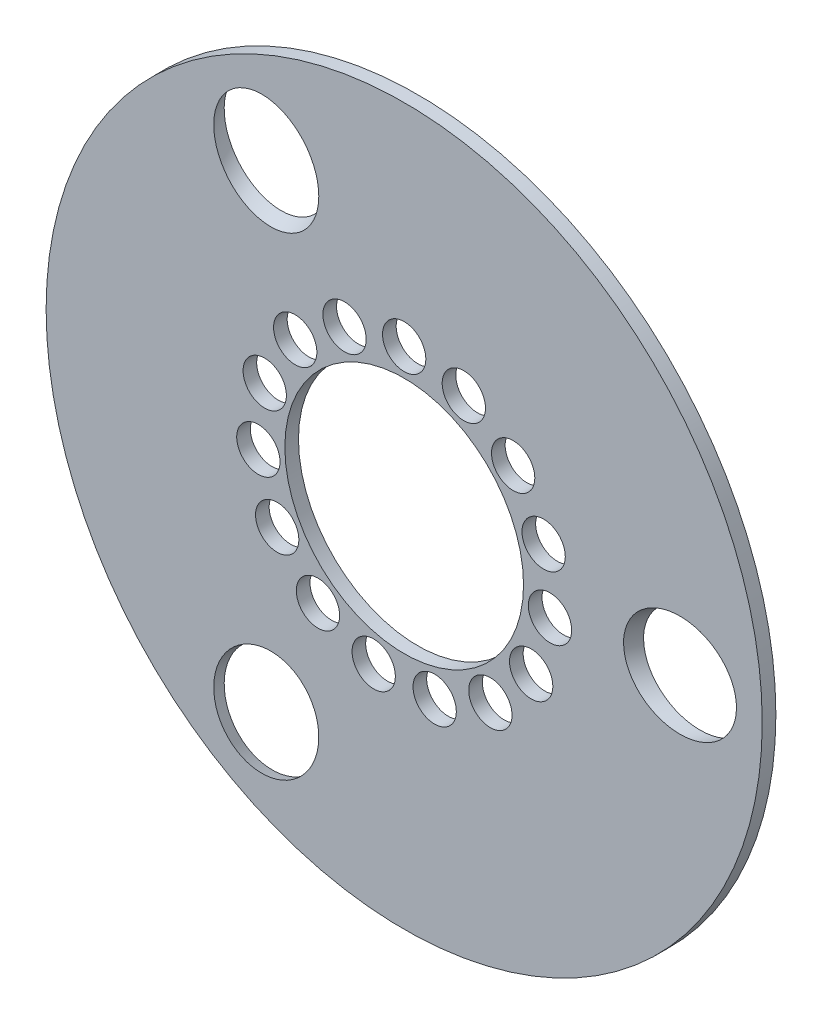
ISO-10303-21;
HEADER;
FILE_DESCRIPTION(('STEP AP214'),'2;1');
FILE_NAME('part.step','',(''),(''),'','','');
FILE_SCHEMA(('AUTOMOTIVE_DESIGN { 1 0 10303 214 1 1 1 1 }'));
ENDSEC;
DATA;
#1=APPLICATION_CONTEXT('core data for automotive mechanical design processes');
#2=APPLICATION_PROTOCOL_DEFINITION('international standard','automotive_design',2000,#1);
#3=PRODUCT_CONTEXT('',#1,'mechanical');
#4=PRODUCT('Part','Part','',(#3));
#5=PRODUCT_RELATED_PRODUCT_CATEGORY('part','',(#4));
#6=PRODUCT_DEFINITION_FORMATION('','',#4);
#7=PRODUCT_DEFINITION_CONTEXT('part definition',#1,'design');
#8=PRODUCT_DEFINITION('design','',#6,#7);
#9=PRODUCT_DEFINITION_SHAPE('','',#8);
#10=(LENGTH_UNIT() NAMED_UNIT(*) SI_UNIT(.MILLI.,.METRE.));
#11=(NAMED_UNIT(*) PLANE_ANGLE_UNIT() SI_UNIT($,.RADIAN.));
#12=(NAMED_UNIT(*) SI_UNIT($,.STERADIAN.) SOLID_ANGLE_UNIT());
#13=UNCERTAINTY_MEASURE_WITH_UNIT(LENGTH_MEASURE(1.E-05),#10,'distance_accuracy_value','');
#14=(GEOMETRIC_REPRESENTATION_CONTEXT(3) GLOBAL_UNCERTAINTY_ASSIGNED_CONTEXT((#13)) GLOBAL_UNIT_ASSIGNED_CONTEXT((#10,
#11,#12)) REPRESENTATION_CONTEXT('',''));
#15=CARTESIAN_POINT('',(0.,0.,0.));
#16=DIRECTION('',(0.,0.,1.));
#17=DIRECTION('',(1.,0.,0.));
#18=AXIS2_PLACEMENT_3D('',#15,#16,#17);
#19=CARTESIAN_POINT('',(0.,0.,2.));
#20=DIRECTION('',(0.,0.,-1.));
#21=DIRECTION('',(-1.,0.,0.));
#22=AXIS2_PLACEMENT_3D('',#19,#20,#21);
#23=CYLINDRICAL_SURFACE('',#22,52.5);
#24=CARTESIAN_POINT('',(0.,0.,2.));
#25=DIRECTION('',(0.,0.,1.));
#26=DIRECTION('',(1.,0.,0.));
#27=AXIS2_PLACEMENT_3D('',#24,#25,#26);
#28=CIRCLE('',#27,52.5);
#29=CARTESIAN_POINT('',(52.5,0.,2.));
#30=VERTEX_POINT('',#29);
#31=EDGE_CURVE('E10',#30,#30,#28,.T.);
#32=ORIENTED_EDGE('',*,*,#31,.F.);
#33=EDGE_LOOP('',(#32));
#34=FACE_BOUND('',#33,.T.);
#35=CARTESIAN_POINT('',(0.,0.,0.));
#36=DIRECTION('',(0.,0.,1.));
#37=DIRECTION('',(1.,0.,0.));
#38=AXIS2_PLACEMENT_3D('',#35,#36,#37);
#39=CIRCLE('',#38,52.5);
#40=CARTESIAN_POINT('',(52.5,0.,0.));
#41=VERTEX_POINT('',#40);
#42=EDGE_CURVE('E40',#41,#41,#39,.T.);
#43=ORIENTED_EDGE('',*,*,#42,.T.);
#44=EDGE_LOOP('',(#43));
#45=FACE_BOUND('',#44,.T.);
#46=ADVANCED_FACE('F33',(#34,#45),#23,.T.);
#47=CARTESIAN_POINT('',(0.,0.,2.));
#48=DIRECTION('',(0.,0.,1.));
#49=DIRECTION('',(1.,0.,0.));
#50=AXIS2_PLACEMENT_3D('',#47,#48,#49);
#51=PLANE('',#50);
#52=CARTESIAN_POINT('',(0.,0.,2.));
#53=DIRECTION('',(0.,0.,1.));
#54=DIRECTION('',(1.,0.,0.));
#55=AXIS2_PLACEMENT_3D('',#52,#53,#54);
#56=CIRCLE('',#55,17.5);
#57=CARTESIAN_POINT('',(17.5,0.,2.));
#58=VERTEX_POINT('',#57);
#59=EDGE_CURVE('E67',#58,#58,#56,.F.);
#60=ORIENTED_EDGE('',*,*,#59,.T.);
#61=EDGE_LOOP('',(#60));
#62=FACE_BOUND('',#61,.T.);
#63=CARTESIAN_POINT('',(-20.2220283223916,35.0255804864794,2.));
#64=DIRECTION('',(0.,0.,1.));
#65=DIRECTION('',(0.499999999999998,-0.86602540378444,0.));
#66=AXIS2_PLACEMENT_3D('',#63,#64,#65);
#67=ELLIPSE('',#66,8.27533439221869,7.5);
#68=CARTESIAN_POINT('',(-16.0843611262823,27.8589306780069,2.));
#69=VERTEX_POINT('',#68);
#70=EDGE_CURVE('E57',#69,#69,#67,.T.);
#71=ORIENTED_EDGE('',*,*,#70,.F.);
#72=EDGE_LOOP('',(#71));
#73=FACE_BOUND('',#72,.T.);
#74=CARTESIAN_POINT('',(-20.2220283223916,-35.0255804864793,2.));
#75=DIRECTION('',(0.,0.,1.));
#76=DIRECTION('',(0.499999999999998,0.86602540378444,0.));
#77=AXIS2_PLACEMENT_3D('',#74,#75,#76);
#78=ELLIPSE('',#77,8.27533439221866,7.5);
#79=CARTESIAN_POINT('',(-16.0843611262822,-27.8589306780068,2.));
#80=VERTEX_POINT('',#79);
#81=EDGE_CURVE('E54',#80,#80,#78,.F.);
#82=ORIENTED_EDGE('',*,*,#81,.T.);
#83=EDGE_LOOP('',(#82));
#84=FACE_BOUND('',#83,.T.);
#85=CARTESIAN_POINT('',(40.4440566447835,0.,2.));
#86=DIRECTION('',(0.,0.,1.));
#87=DIRECTION('',(-1.,0.,0.));
#88=AXIS2_PLACEMENT_3D('',#85,#86,#87);
#89=ELLIPSE('',#88,8.27533439221869,7.5);
#90=CARTESIAN_POINT('',(32.1687222525648,0.,2.));
#91=VERTEX_POINT('',#90);
#92=EDGE_CURVE('E53',#91,#91,#89,.T.);
#93=ORIENTED_EDGE('',*,*,#92,.F.);
#94=EDGE_LOOP('',(#93));
#95=FACE_BOUND('',#94,.T.);
#96=CARTESIAN_POINT('',(8.74483782612977,19.6412273393163,2.));
#97=DIRECTION('',(0.,0.,1.));
#98=DIRECTION('',(1.,0.,0.));
#99=AXIS2_PLACEMENT_3D('',#96,#97,#98);
#100=CIRCLE('',#99,3.175);
#101=CARTESIAN_POINT('',(11.9198378261298,19.6412273393163,2.));
#102=VERTEX_POINT('',#101);
#103=EDGE_CURVE('E110',#102,#102,#100,.T.);
#104=ORIENTED_EDGE('',*,*,#103,.F.);
#105=EDGE_LOOP('',(#104));
#106=FACE_BOUND('',#105,.T.);
#107=CARTESIAN_POINT('',(15.9776137477643,14.3863080367161,2.));
#108=DIRECTION('',(0.,0.,1.));
#109=DIRECTION('',(1.,0.,0.));
#110=AXIS2_PLACEMENT_3D('',#107,#108,#109);
#111=CIRCLE('',#110,3.175);
#112=CARTESIAN_POINT('',(19.1526137477643,14.3863080367161,2.));
#113=VERTEX_POINT('',#112);
#114=EDGE_CURVE('E116',#113,#113,#111,.T.);
#115=ORIENTED_EDGE('',*,*,#114,.F.);
#116=EDGE_LOOP('',(#115));
#117=FACE_BOUND('',#116,.T.);
#118=CARTESIAN_POINT('',(20.4477151003464,6.64386537906218,2.));
#119=DIRECTION('',(0.,0.,1.));
#120=DIRECTION('',(1.,0.,0.));
#121=AXIS2_PLACEMENT_3D('',#118,#119,#120);
#122=CIRCLE('',#121,3.175);
#123=CARTESIAN_POINT('',(23.6227151003464,6.64386537906218,2.));
#124=VERTEX_POINT('',#123);
#125=EDGE_CURVE('E122',#124,#124,#122,.T.);
#126=ORIENTED_EDGE('',*,*,#125,.F.);
#127=EDGE_LOOP('',(#126));
#128=FACE_BOUND('',#127,.T.);
#129=CARTESIAN_POINT('',(21.3822207504188,-2.2473619602537,2.));
#130=DIRECTION('',(0.,0.,1.));
#131=DIRECTION('',(1.,0.,0.));
#132=AXIS2_PLACEMENT_3D('',#129,#130,#131);
#133=CIRCLE('',#132,3.175);
#134=CARTESIAN_POINT('',(24.5572207504188,-2.2473619602537,2.));
#135=VERTEX_POINT('',#134);
#136=EDGE_CURVE('E128',#135,#135,#133,.T.);
#137=ORIENTED_EDGE('',*,*,#136,.F.);
#138=EDGE_LOOP('',(#137));
#139=FACE_BOUND('',#138,.T.);
#140=CARTESIAN_POINT('',(18.6195461813667,-10.7499999999993,2.));
#141=DIRECTION('',(0.,0.,1.));
#142=DIRECTION('',(1.,0.,0.));
#143=AXIS2_PLACEMENT_3D('',#140,#141,#142);
#144=CIRCLE('',#143,3.175);
#145=CARTESIAN_POINT('',(21.7945461813667,-10.7499999999993,2.));
#146=VERTEX_POINT('',#145);
#147=EDGE_CURVE('E134',#146,#146,#144,.T.);
#148=ORIENTED_EDGE('',*,*,#147,.F.);
#149=EDGE_LOOP('',(#148));
#150=FACE_BOUND('',#149,.T.);
#151=CARTESIAN_POINT('',(12.6373829242897,-17.3938653790609,2.));
#152=DIRECTION('',(0.,0.,1.));
#153=DIRECTION('',(1.,0.,0.));
#154=AXIS2_PLACEMENT_3D('',#151,#152,#153);
#155=CIRCLE('',#154,3.175);
#156=CARTESIAN_POINT('',(15.8123829242897,-17.3938653790609,2.));
#157=VERTEX_POINT('',#156);
#158=EDGE_CURVE('E140',#157,#157,#155,.T.);
#159=ORIENTED_EDGE('',*,*,#158,.F.);
#160=EDGE_LOOP('',(#159));
#161=FACE_BOUND('',#160,.T.);
#162=CARTESIAN_POINT('',(4.47010135258351,-21.0301734157766,2.));
#163=DIRECTION('',(0.,0.,1.));
#164=DIRECTION('',(1.,0.,0.));
#165=AXIS2_PLACEMENT_3D('',#162,#163,#164);
#166=CIRCLE('',#165,3.175);
#167=CARTESIAN_POINT('',(7.64510135258351,-21.0301734157766,2.));
#168=VERTEX_POINT('',#167);
#169=EDGE_CURVE('E146',#168,#168,#166,.T.);
#170=ORIENTED_EDGE('',*,*,#169,.F.);
#171=EDGE_LOOP('',(#170));
#172=FACE_BOUND('',#171,.T.);
#173=CARTESIAN_POINT('',(-4.47010135258014,-21.030173415777,2.));
#174=DIRECTION('',(0.,0.,1.));
#175=DIRECTION('',(1.,0.,0.));
#176=AXIS2_PLACEMENT_3D('',#173,#174,#175);
#177=CIRCLE('',#176,3.175);
#178=CARTESIAN_POINT('',(-1.29510135258014,-21.030173415777,2.));
#179=VERTEX_POINT('',#178);
#180=EDGE_CURVE('E152',#179,#179,#177,.T.);
#181=ORIENTED_EDGE('',*,*,#180,.F.);
#182=EDGE_LOOP('',(#181));
#183=FACE_BOUND('',#182,.T.);
#184=CARTESIAN_POINT('',(-12.6373829242866,-17.3938653790619,2.));
#185=DIRECTION('',(0.,0.,1.));
#186=DIRECTION('',(1.,0.,0.));
#187=AXIS2_PLACEMENT_3D('',#184,#185,#186);
#188=CIRCLE('',#187,3.175);
#189=CARTESIAN_POINT('',(-9.46238292428663,-17.3938653790619,2.));
#190=VERTEX_POINT('',#189);
#191=EDGE_CURVE('E74',#190,#190,#188,.T.);
#192=ORIENTED_EDGE('',*,*,#191,.F.);
#193=EDGE_LOOP('',(#192));
#194=FACE_BOUND('',#193,.T.);
#195=CARTESIAN_POINT('',(-18.6195461813642,-10.7500000000007,2.));
#196=DIRECTION('',(0.,0.,1.));
#197=DIRECTION('',(1.,0.,0.));
#198=AXIS2_PLACEMENT_3D('',#195,#196,#197);
#199=CIRCLE('',#198,3.175);
#200=CARTESIAN_POINT('',(-15.4445461813642,-10.7500000000007,2.));
#201=VERTEX_POINT('',#200);
#202=EDGE_CURVE('E81',#201,#201,#199,.T.);
#203=ORIENTED_EDGE('',*,*,#202,.F.);
#204=EDGE_LOOP('',(#203));
#205=FACE_BOUND('',#204,.T.);
#206=CARTESIAN_POINT('',(-21.3822207504169,-2.24736196025541,2.));
#207=DIRECTION('',(0.,0.,1.));
#208=DIRECTION('',(1.,0.,0.));
#209=AXIS2_PLACEMENT_3D('',#206,#207,#208);
#210=CIRCLE('',#209,3.175);
#211=CARTESIAN_POINT('',(-18.2072207504169,-2.24736196025541,2.));
#212=VERTEX_POINT('',#211);
#213=EDGE_CURVE('E87',#212,#212,#210,.T.);
#214=ORIENTED_EDGE('',*,*,#213,.F.);
#215=EDGE_LOOP('',(#214));
#216=FACE_BOUND('',#215,.T.);
#217=CARTESIAN_POINT('',(-20.4477151003452,6.64386537906056,2.));
#218=DIRECTION('',(0.,0.,1.));
#219=DIRECTION('',(1.,0.,0.));
#220=AXIS2_PLACEMENT_3D('',#217,#218,#219);
#221=CIRCLE('',#220,3.175);
#222=CARTESIAN_POINT('',(-17.2727151003452,6.64386537906056,2.));
#223=VERTEX_POINT('',#222);
#224=EDGE_CURVE('E93',#223,#223,#221,.T.);
#225=ORIENTED_EDGE('',*,*,#224,.F.);
#226=EDGE_LOOP('',(#225));
#227=FACE_BOUND('',#226,.T.);
#228=CARTESIAN_POINT('',(-15.9776137477637,14.3863080367148,2.));
#229=DIRECTION('',(0.,0.,1.));
#230=DIRECTION('',(1.,0.,0.));
#231=AXIS2_PLACEMENT_3D('',#228,#229,#230);
#232=CIRCLE('',#231,3.175);
#233=CARTESIAN_POINT('',(-12.8026137477637,14.3863080367148,2.));
#234=VERTEX_POINT('',#233);
#235=EDGE_CURVE('E99',#234,#234,#232,.T.);
#236=ORIENTED_EDGE('',*,*,#235,.F.);
#237=EDGE_LOOP('',(#236));
#238=FACE_BOUND('',#237,.T.);
#239=CARTESIAN_POINT('',(-8.74483782612965,19.6412273393156,2.));
#240=DIRECTION('',(0.,0.,1.));
#241=DIRECTION('',(1.,0.,0.));
#242=AXIS2_PLACEMENT_3D('',#239,#240,#241);
#243=CIRCLE('',#242,3.175);
#244=CARTESIAN_POINT('',(-5.56983782612965,19.6412273393156,2.));
#245=VERTEX_POINT('',#244);
#246=EDGE_CURVE('E105',#245,#245,#243,.T.);
#247=ORIENTED_EDGE('',*,*,#246,.F.);
#248=EDGE_LOOP('',(#247));
#249=FACE_BOUND('',#248,.T.);
#250=CARTESIAN_POINT('',(0.,21.5,2.));
#251=DIRECTION('',(0.,0.,1.));
#252=DIRECTION('',(1.,0.,0.));
#253=AXIS2_PLACEMENT_3D('',#250,#251,#252);
#254=CIRCLE('',#253,3.175);
#255=CARTESIAN_POINT('',(3.175,21.5,2.));
#256=VERTEX_POINT('',#255);
#257=EDGE_CURVE('E45',#256,#256,#254,.T.);
#258=ORIENTED_EDGE('',*,*,#257,.F.);
#259=EDGE_LOOP('',(#258));
#260=FACE_BOUND('',#259,.T.);
#261=ORIENTED_EDGE('',*,*,#31,.T.);
#262=EDGE_LOOP('',(#261));
#263=FACE_BOUND('',#262,.T.);
#264=ADVANCED_FACE('F176',(#62,#73,#84,#95,#106,#117,#128,#139,#150,#161,#172,#183,#194,#205,
#216,#227,#238,#249,#260,#263),#51,.T.);
#265=CARTESIAN_POINT('',(0.,0.,0.));
#266=DIRECTION('',(0.,0.,1.));
#267=DIRECTION('',(1.,0.,0.));
#268=AXIS2_PLACEMENT_3D('',#265,#266,#267);
#269=PLANE('',#268);
#270=CARTESIAN_POINT('',(0.,0.,0.));
#271=DIRECTION('',(0.,0.,1.));
#272=DIRECTION('',(1.,0.,0.));
#273=AXIS2_PLACEMENT_3D('',#270,#271,#272);
#274=CIRCLE('',#273,17.5);
#275=CARTESIAN_POINT('',(17.5,0.,0.));
#276=VERTEX_POINT('',#275);
#277=EDGE_CURVE('E321',#276,#276,#274,.T.);
#278=ORIENTED_EDGE('',*,*,#277,.T.);
#279=EDGE_LOOP('',(#278));
#280=FACE_BOUND('',#279,.T.);
#281=CARTESIAN_POINT('',(-20.6883359805466,35.8332490423623,0.));
#282=DIRECTION('',(0.,0.,1.));
#283=DIRECTION('',(0.499999999999998,-0.86602540378444,0.));
#284=AXIS2_PLACEMENT_3D('',#281,#282,#283);
#285=ELLIPSE('',#284,8.27533439221869,7.5);
#286=CARTESIAN_POINT('',(-16.5506687844373,28.6665992338898,0.));
#287=VERTEX_POINT('',#286);
#288=EDGE_CURVE('E36',#287,#287,#285,.T.);
#289=ORIENTED_EDGE('',*,*,#288,.T.);
#290=EDGE_LOOP('',(#289));
#291=FACE_BOUND('',#290,.T.);
#292=CARTESIAN_POINT('',(-20.6883359805465,-35.8332490423622,0.));
#293=DIRECTION('',(0.,0.,1.));
#294=DIRECTION('',(0.499999999999998,0.86602540378444,0.));
#295=AXIS2_PLACEMENT_3D('',#292,#293,#294);
#296=ELLIPSE('',#295,8.27533439221866,7.5);
#297=CARTESIAN_POINT('',(-16.5506687844372,-28.6665992338897,0.));
#298=VERTEX_POINT('',#297);
#299=EDGE_CURVE('E55',#298,#298,#296,.F.);
#300=ORIENTED_EDGE('',*,*,#299,.F.);
#301=EDGE_LOOP('',(#300));
#302=FACE_BOUND('',#301,.T.);
#303=CARTESIAN_POINT('',(41.3766719610935,0.,0.));
#304=DIRECTION('',(0.,0.,1.));
#305=DIRECTION('',(-1.,0.,0.));
#306=AXIS2_PLACEMENT_3D('',#303,#304,#305);
#307=ELLIPSE('',#306,8.27533439221869,7.5);
#308=CARTESIAN_POINT('',(33.1013375688748,0.,0.));
#309=VERTEX_POINT('',#308);
#310=EDGE_CURVE('E51',#309,#309,#307,.T.);
#311=ORIENTED_EDGE('',*,*,#310,.T.);
#312=EDGE_LOOP('',(#311));
#313=FACE_BOUND('',#312,.T.);
#314=CARTESIAN_POINT('',(8.74483782612977,19.6412273393163,0.));
#315=DIRECTION('',(0.,0.,1.));
#316=DIRECTION('',(1.,0.,0.));
#317=AXIS2_PLACEMENT_3D('',#314,#315,#316);
#318=CIRCLE('',#317,3.175);
#319=CARTESIAN_POINT('',(11.9198378261298,19.6412273393163,0.));
#320=VERTEX_POINT('',#319);
#321=EDGE_CURVE('E113',#320,#320,#318,.T.);
#322=ORIENTED_EDGE('',*,*,#321,.T.);
#323=EDGE_LOOP('',(#322));
#324=FACE_BOUND('',#323,.T.);
#325=CARTESIAN_POINT('',(15.9776137477643,14.3863080367161,0.));
#326=DIRECTION('',(0.,0.,1.));
#327=DIRECTION('',(1.,0.,0.));
#328=AXIS2_PLACEMENT_3D('',#325,#326,#327);
#329=CIRCLE('',#328,3.175);
#330=CARTESIAN_POINT('',(19.1526137477643,14.3863080367161,0.));
#331=VERTEX_POINT('',#330);
#332=EDGE_CURVE('E119',#331,#331,#329,.T.);
#333=ORIENTED_EDGE('',*,*,#332,.T.);
#334=EDGE_LOOP('',(#333));
#335=FACE_BOUND('',#334,.T.);
#336=CARTESIAN_POINT('',(20.4477151003464,6.64386537906218,0.));
#337=DIRECTION('',(0.,0.,1.));
#338=DIRECTION('',(1.,0.,0.));
#339=AXIS2_PLACEMENT_3D('',#336,#337,#338);
#340=CIRCLE('',#339,3.175);
#341=CARTESIAN_POINT('',(23.6227151003464,6.64386537906218,0.));
#342=VERTEX_POINT('',#341);
#343=EDGE_CURVE('E125',#342,#342,#340,.T.);
#344=ORIENTED_EDGE('',*,*,#343,.T.);
#345=EDGE_LOOP('',(#344));
#346=FACE_BOUND('',#345,.T.);
#347=CARTESIAN_POINT('',(21.3822207504188,-2.2473619602537,0.));
#348=DIRECTION('',(0.,0.,1.));
#349=DIRECTION('',(1.,0.,0.));
#350=AXIS2_PLACEMENT_3D('',#347,#348,#349);
#351=CIRCLE('',#350,3.175);
#352=CARTESIAN_POINT('',(24.5572207504188,-2.2473619602537,0.));
#353=VERTEX_POINT('',#352);
#354=EDGE_CURVE('E131',#353,#353,#351,.T.);
#355=ORIENTED_EDGE('',*,*,#354,.T.);
#356=EDGE_LOOP('',(#355));
#357=FACE_BOUND('',#356,.T.);
#358=CARTESIAN_POINT('',(18.6195461813667,-10.7499999999993,0.));
#359=DIRECTION('',(0.,0.,1.));
#360=DIRECTION('',(1.,0.,0.));
#361=AXIS2_PLACEMENT_3D('',#358,#359,#360);
#362=CIRCLE('',#361,3.175);
#363=CARTESIAN_POINT('',(21.7945461813667,-10.7499999999993,0.));
#364=VERTEX_POINT('',#363);
#365=EDGE_CURVE('E137',#364,#364,#362,.T.);
#366=ORIENTED_EDGE('',*,*,#365,.T.);
#367=EDGE_LOOP('',(#366));
#368=FACE_BOUND('',#367,.T.);
#369=CARTESIAN_POINT('',(12.6373829242897,-17.3938653790609,0.));
#370=DIRECTION('',(0.,0.,1.));
#371=DIRECTION('',(1.,0.,0.));
#372=AXIS2_PLACEMENT_3D('',#369,#370,#371);
#373=CIRCLE('',#372,3.175);
#374=CARTESIAN_POINT('',(15.8123829242897,-17.3938653790609,0.));
#375=VERTEX_POINT('',#374);
#376=EDGE_CURVE('E143',#375,#375,#373,.T.);
#377=ORIENTED_EDGE('',*,*,#376,.T.);
#378=EDGE_LOOP('',(#377));
#379=FACE_BOUND('',#378,.T.);
#380=CARTESIAN_POINT('',(4.47010135258351,-21.0301734157766,0.));
#381=DIRECTION('',(0.,0.,1.));
#382=DIRECTION('',(1.,0.,0.));
#383=AXIS2_PLACEMENT_3D('',#380,#381,#382);
#384=CIRCLE('',#383,3.175);
#385=CARTESIAN_POINT('',(7.64510135258351,-21.0301734157766,0.));
#386=VERTEX_POINT('',#385);
#387=EDGE_CURVE('E149',#386,#386,#384,.T.);
#388=ORIENTED_EDGE('',*,*,#387,.T.);
#389=EDGE_LOOP('',(#388));
#390=FACE_BOUND('',#389,.T.);
#391=CARTESIAN_POINT('',(-4.47010135258014,-21.030173415777,0.));
#392=DIRECTION('',(0.,0.,1.));
#393=DIRECTION('',(1.,0.,0.));
#394=AXIS2_PLACEMENT_3D('',#391,#392,#393);
#395=CIRCLE('',#394,3.175);
#396=CARTESIAN_POINT('',(-1.29510135258014,-21.030173415777,0.));
#397=VERTEX_POINT('',#396);
#398=EDGE_CURVE('E77',#397,#397,#395,.T.);
#399=ORIENTED_EDGE('',*,*,#398,.T.);
#400=EDGE_LOOP('',(#399));
#401=FACE_BOUND('',#400,.T.);
#402=CARTESIAN_POINT('',(-12.6373829242866,-17.3938653790619,0.));
#403=DIRECTION('',(0.,0.,1.));
#404=DIRECTION('',(1.,0.,0.));
#405=AXIS2_PLACEMENT_3D('',#402,#403,#404);
#406=CIRCLE('',#405,3.175);
#407=CARTESIAN_POINT('',(-9.46238292428663,-17.3938653790619,0.));
#408=VERTEX_POINT('',#407);
#409=EDGE_CURVE('E78',#408,#408,#406,.T.);
#410=ORIENTED_EDGE('',*,*,#409,.T.);
#411=EDGE_LOOP('',(#410));
#412=FACE_BOUND('',#411,.T.);
#413=CARTESIAN_POINT('',(-18.6195461813642,-10.7500000000007,0.));
#414=DIRECTION('',(0.,0.,1.));
#415=DIRECTION('',(1.,0.,0.));
#416=AXIS2_PLACEMENT_3D('',#413,#414,#415);
#417=CIRCLE('',#416,3.175);
#418=CARTESIAN_POINT('',(-15.4445461813642,-10.7500000000007,0.));
#419=VERTEX_POINT('',#418);
#420=EDGE_CURVE('E84',#419,#419,#417,.T.);
#421=ORIENTED_EDGE('',*,*,#420,.T.);
#422=EDGE_LOOP('',(#421));
#423=FACE_BOUND('',#422,.T.);
#424=CARTESIAN_POINT('',(-21.3822207504169,-2.24736196025541,0.));
#425=DIRECTION('',(0.,0.,1.));
#426=DIRECTION('',(1.,0.,0.));
#427=AXIS2_PLACEMENT_3D('',#424,#425,#426);
#428=CIRCLE('',#427,3.175);
#429=CARTESIAN_POINT('',(-18.2072207504169,-2.24736196025541,0.));
#430=VERTEX_POINT('',#429);
#431=EDGE_CURVE('E90',#430,#430,#428,.T.);
#432=ORIENTED_EDGE('',*,*,#431,.T.);
#433=EDGE_LOOP('',(#432));
#434=FACE_BOUND('',#433,.T.);
#435=CARTESIAN_POINT('',(-20.4477151003452,6.64386537906056,0.));
#436=DIRECTION('',(0.,0.,1.));
#437=DIRECTION('',(1.,0.,0.));
#438=AXIS2_PLACEMENT_3D('',#435,#436,#437);
#439=CIRCLE('',#438,3.175);
#440=CARTESIAN_POINT('',(-17.2727151003452,6.64386537906056,0.));
#441=VERTEX_POINT('',#440);
#442=EDGE_CURVE('E96',#441,#441,#439,.T.);
#443=ORIENTED_EDGE('',*,*,#442,.T.);
#444=EDGE_LOOP('',(#443));
#445=FACE_BOUND('',#444,.T.);
#446=CARTESIAN_POINT('',(-15.9776137477637,14.3863080367148,0.));
#447=DIRECTION('',(0.,0.,1.));
#448=DIRECTION('',(1.,0.,0.));
#449=AXIS2_PLACEMENT_3D('',#446,#447,#448);
#450=CIRCLE('',#449,3.175);
#451=CARTESIAN_POINT('',(-12.8026137477637,14.3863080367148,0.));
#452=VERTEX_POINT('',#451);
#453=EDGE_CURVE('E102',#452,#452,#450,.T.);
#454=ORIENTED_EDGE('',*,*,#453,.T.);
#455=EDGE_LOOP('',(#454));
#456=FACE_BOUND('',#455,.T.);
#457=CARTESIAN_POINT('',(-8.74483782612965,19.6412273393156,0.));
#458=DIRECTION('',(0.,0.,1.));
#459=DIRECTION('',(1.,0.,0.));
#460=AXIS2_PLACEMENT_3D('',#457,#458,#459);
#461=CIRCLE('',#460,3.175);
#462=CARTESIAN_POINT('',(-5.56983782612965,19.6412273393156,0.));
#463=VERTEX_POINT('',#462);
#464=EDGE_CURVE('E73',#463,#463,#461,.T.);
#465=ORIENTED_EDGE('',*,*,#464,.T.);
#466=EDGE_LOOP('',(#465));
#467=FACE_BOUND('',#466,.T.);
#468=CARTESIAN_POINT('',(0.,21.5,0.));
#469=DIRECTION('',(0.,0.,1.));
#470=DIRECTION('',(1.,0.,0.));
#471=AXIS2_PLACEMENT_3D('',#468,#469,#470);
#472=CIRCLE('',#471,3.175);
#473=CARTESIAN_POINT('',(3.175,21.5,0.));
#474=VERTEX_POINT('',#473);
#475=EDGE_CURVE('E48',#474,#474,#472,.T.);
#476=ORIENTED_EDGE('',*,*,#475,.T.);
#477=EDGE_LOOP('',(#476));
#478=FACE_BOUND('',#477,.T.);
#479=ORIENTED_EDGE('',*,*,#42,.F.);
#480=EDGE_LOOP('',(#479));
#481=FACE_BOUND('',#480,.T.);
#482=ADVANCED_FACE('F162',(#280,#291,#302,#313,#324,#335,#346,#357,#368,#379,#390,#401,#412,
#423,#434,#445,#456,#467,#478,#481),#269,.F.);
#483=CARTESIAN_POINT('',(0.,21.5,2.));
#484=DIRECTION('',(0.,0.,-1.));
#485=DIRECTION('',(-1.,0.,0.));
#486=AXIS2_PLACEMENT_3D('',#483,#484,#485);
#487=CYLINDRICAL_SURFACE('',#486,3.175);
#488=ORIENTED_EDGE('',*,*,#257,.T.);
#489=EDGE_LOOP('',(#488));
#490=FACE_BOUND('',#489,.T.);
#491=ORIENTED_EDGE('',*,*,#475,.F.);
#492=EDGE_LOOP('',(#491));
#493=FACE_BOUND('',#492,.T.);
#494=ADVANCED_FACE('F165',(#490,#493),#487,.F.);
#495=CARTESIAN_POINT('',(-8.74483782612965,19.6412273393156,2.));
#496=DIRECTION('',(0.,0.,-1.));
#497=DIRECTION('',(-1.,0.,0.));
#498=AXIS2_PLACEMENT_3D('',#495,#496,#497);
#499=CYLINDRICAL_SURFACE('',#498,3.175);
#500=ORIENTED_EDGE('',*,*,#246,.T.);
#501=EDGE_LOOP('',(#500));
#502=FACE_BOUND('',#501,.T.);
#503=ORIENTED_EDGE('',*,*,#464,.F.);
#504=EDGE_LOOP('',(#503));
#505=FACE_BOUND('',#504,.T.);
#506=ADVANCED_FACE('F167',(#502,#505),#499,.F.);
#507=CARTESIAN_POINT('',(-15.9776137477637,14.3863080367148,2.));
#508=DIRECTION('',(0.,0.,-1.));
#509=DIRECTION('',(-1.,0.,0.));
#510=AXIS2_PLACEMENT_3D('',#507,#508,#509);
#511=CYLINDRICAL_SURFACE('',#510,3.175);
#512=ORIENTED_EDGE('',*,*,#235,.T.);
#513=EDGE_LOOP('',(#512));
#514=FACE_BOUND('',#513,.T.);
#515=ORIENTED_EDGE('',*,*,#453,.F.);
#516=EDGE_LOOP('',(#515));
#517=FACE_BOUND('',#516,.T.);
#518=ADVANCED_FACE('F173',(#514,#517),#511,.F.);
#519=CARTESIAN_POINT('',(-20.4477151003452,6.64386537906056,2.));
#520=DIRECTION('',(0.,0.,-1.));
#521=DIRECTION('',(-1.,0.,0.));
#522=AXIS2_PLACEMENT_3D('',#519,#520,#521);
#523=CYLINDRICAL_SURFACE('',#522,3.175);
#524=ORIENTED_EDGE('',*,*,#224,.T.);
#525=EDGE_LOOP('',(#524));
#526=FACE_BOUND('',#525,.T.);
#527=ORIENTED_EDGE('',*,*,#442,.F.);
#528=EDGE_LOOP('',(#527));
#529=FACE_BOUND('',#528,.T.);
#530=ADVANCED_FACE('F232',(#526,#529),#523,.F.);
#531=CARTESIAN_POINT('',(-21.3822207504169,-2.24736196025541,2.));
#532=DIRECTION('',(0.,0.,-1.));
#533=DIRECTION('',(-1.,0.,0.));
#534=AXIS2_PLACEMENT_3D('',#531,#532,#533);
#535=CYLINDRICAL_SURFACE('',#534,3.175);
#536=ORIENTED_EDGE('',*,*,#213,.T.);
#537=EDGE_LOOP('',(#536));
#538=FACE_BOUND('',#537,.T.);
#539=ORIENTED_EDGE('',*,*,#431,.F.);
#540=EDGE_LOOP('',(#539));
#541=FACE_BOUND('',#540,.T.);
#542=ADVANCED_FACE('F239',(#538,#541),#535,.F.);
#543=CARTESIAN_POINT('',(-18.6195461813642,-10.7500000000007,2.));
#544=DIRECTION('',(0.,0.,-1.));
#545=DIRECTION('',(-1.,0.,0.));
#546=AXIS2_PLACEMENT_3D('',#543,#544,#545);
#547=CYLINDRICAL_SURFACE('',#546,3.175);
#548=ORIENTED_EDGE('',*,*,#202,.T.);
#549=EDGE_LOOP('',(#548));
#550=FACE_BOUND('',#549,.T.);
#551=ORIENTED_EDGE('',*,*,#420,.F.);
#552=EDGE_LOOP('',(#551));
#553=FACE_BOUND('',#552,.T.);
#554=ADVANCED_FACE('F279',(#550,#553),#547,.F.);
#555=CARTESIAN_POINT('',(-12.6373829242866,-17.3938653790619,2.));
#556=DIRECTION('',(0.,0.,-1.));
#557=DIRECTION('',(-1.,0.,0.));
#558=AXIS2_PLACEMENT_3D('',#555,#556,#557);
#559=CYLINDRICAL_SURFACE('',#558,3.175);
#560=ORIENTED_EDGE('',*,*,#191,.T.);
#561=EDGE_LOOP('',(#560));
#562=FACE_BOUND('',#561,.T.);
#563=ORIENTED_EDGE('',*,*,#409,.F.);
#564=EDGE_LOOP('',(#563));
#565=FACE_BOUND('',#564,.T.);
#566=ADVANCED_FACE('F274',(#562,#565),#559,.F.);
#567=CARTESIAN_POINT('',(-4.47010135258014,-21.030173415777,2.));
#568=DIRECTION('',(0.,0.,-1.));
#569=DIRECTION('',(-1.,0.,0.));
#570=AXIS2_PLACEMENT_3D('',#567,#568,#569);
#571=CYLINDRICAL_SURFACE('',#570,3.175);
#572=ORIENTED_EDGE('',*,*,#180,.T.);
#573=EDGE_LOOP('',(#572));
#574=FACE_BOUND('',#573,.T.);
#575=ORIENTED_EDGE('',*,*,#398,.F.);
#576=EDGE_LOOP('',(#575));
#577=FACE_BOUND('',#576,.T.);
#578=ADVANCED_FACE('F271',(#574,#577),#571,.F.);
#579=CARTESIAN_POINT('',(4.47010135258351,-21.0301734157766,2.));
#580=DIRECTION('',(0.,0.,-1.));
#581=DIRECTION('',(-1.,0.,0.));
#582=AXIS2_PLACEMENT_3D('',#579,#580,#581);
#583=CYLINDRICAL_SURFACE('',#582,3.175);
#584=ORIENTED_EDGE('',*,*,#169,.T.);
#585=EDGE_LOOP('',(#584));
#586=FACE_BOUND('',#585,.T.);
#587=ORIENTED_EDGE('',*,*,#387,.F.);
#588=EDGE_LOOP('',(#587));
#589=FACE_BOUND('',#588,.T.);
#590=ADVANCED_FACE('F268',(#586,#589),#583,.F.);
#591=CARTESIAN_POINT('',(12.6373829242897,-17.3938653790609,2.));
#592=DIRECTION('',(0.,0.,-1.));
#593=DIRECTION('',(-1.,0.,0.));
#594=AXIS2_PLACEMENT_3D('',#591,#592,#593);
#595=CYLINDRICAL_SURFACE('',#594,3.175);
#596=ORIENTED_EDGE('',*,*,#158,.T.);
#597=EDGE_LOOP('',(#596));
#598=FACE_BOUND('',#597,.T.);
#599=ORIENTED_EDGE('',*,*,#376,.F.);
#600=EDGE_LOOP('',(#599));
#601=FACE_BOUND('',#600,.T.);
#602=ADVANCED_FACE('F264',(#598,#601),#595,.F.);
#603=CARTESIAN_POINT('',(18.6195461813667,-10.7499999999993,2.));
#604=DIRECTION('',(0.,0.,-1.));
#605=DIRECTION('',(-1.,0.,0.));
#606=AXIS2_PLACEMENT_3D('',#603,#604,#605);
#607=CYLINDRICAL_SURFACE('',#606,3.175);
#608=ORIENTED_EDGE('',*,*,#147,.T.);
#609=EDGE_LOOP('',(#608));
#610=FACE_BOUND('',#609,.T.);
#611=ORIENTED_EDGE('',*,*,#365,.F.);
#612=EDGE_LOOP('',(#611));
#613=FACE_BOUND('',#612,.T.);
#614=ADVANCED_FACE('F260',(#610,#613),#607,.F.);
#615=CARTESIAN_POINT('',(21.3822207504188,-2.2473619602537,2.));
#616=DIRECTION('',(0.,0.,-1.));
#617=DIRECTION('',(-1.,0.,0.));
#618=AXIS2_PLACEMENT_3D('',#615,#616,#617);
#619=CYLINDRICAL_SURFACE('',#618,3.175);
#620=ORIENTED_EDGE('',*,*,#136,.T.);
#621=EDGE_LOOP('',(#620));
#622=FACE_BOUND('',#621,.T.);
#623=ORIENTED_EDGE('',*,*,#354,.F.);
#624=EDGE_LOOP('',(#623));
#625=FACE_BOUND('',#624,.T.);
#626=ADVANCED_FACE('F256',(#622,#625),#619,.F.);
#627=CARTESIAN_POINT('',(20.4477151003464,6.64386537906218,2.));
#628=DIRECTION('',(0.,0.,-1.));
#629=DIRECTION('',(-1.,0.,0.));
#630=AXIS2_PLACEMENT_3D('',#627,#628,#629);
#631=CYLINDRICAL_SURFACE('',#630,3.175);
#632=ORIENTED_EDGE('',*,*,#125,.T.);
#633=EDGE_LOOP('',(#632));
#634=FACE_BOUND('',#633,.T.);
#635=ORIENTED_EDGE('',*,*,#343,.F.);
#636=EDGE_LOOP('',(#635));
#637=FACE_BOUND('',#636,.T.);
#638=ADVANCED_FACE('F252',(#634,#637),#631,.F.);
#639=CARTESIAN_POINT('',(15.9776137477643,14.3863080367161,2.));
#640=DIRECTION('',(0.,0.,-1.));
#641=DIRECTION('',(-1.,0.,0.));
#642=AXIS2_PLACEMENT_3D('',#639,#640,#641);
#643=CYLINDRICAL_SURFACE('',#642,3.175);
#644=ORIENTED_EDGE('',*,*,#114,.T.);
#645=EDGE_LOOP('',(#644));
#646=FACE_BOUND('',#645,.T.);
#647=ORIENTED_EDGE('',*,*,#332,.F.);
#648=EDGE_LOOP('',(#647));
#649=FACE_BOUND('',#648,.T.);
#650=ADVANCED_FACE('F248',(#646,#649),#643,.F.);
#651=CARTESIAN_POINT('',(8.74483782612977,19.6412273393163,2.));
#652=DIRECTION('',(0.,0.,-1.));
#653=DIRECTION('',(-1.,0.,0.));
#654=AXIS2_PLACEMENT_3D('',#651,#652,#653);
#655=CYLINDRICAL_SURFACE('',#654,3.175);
#656=ORIENTED_EDGE('',*,*,#103,.T.);
#657=EDGE_LOOP('',(#656));
#658=FACE_BOUND('',#657,.T.);
#659=ORIENTED_EDGE('',*,*,#321,.F.);
#660=EDGE_LOOP('',(#659));
#661=FACE_BOUND('',#660,.T.);
#662=ADVANCED_FACE('F244',(#658,#661),#655,.F.);
#663=CARTESIAN_POINT('',(66.968669861948,0.,-54.8822166080485));
#664=DIRECTION('',(-0.4226182617407,0.,0.906307787036649));
#665=DIRECTION('',(0.906307787036649,0.,0.4226182617407));
#666=AXIS2_PLACEMENT_3D('',#663,#664,#665);
#667=CYLINDRICAL_SURFACE('',#666,7.5);
#668=ORIENTED_EDGE('',*,*,#92,.T.);
#669=EDGE_LOOP('',(#668));
#670=FACE_BOUND('',#669,.T.);
#671=ORIENTED_EDGE('',*,*,#310,.F.);
#672=EDGE_LOOP('',(#671));
#673=FACE_BOUND('',#672,.T.);
#674=ADVANCED_FACE('F247',(#670,#673),#667,.F.);
#675=CARTESIAN_POINT('',(-32.3339275744504,-56.0040053672009,-49.9481035331107));
#676=DIRECTION('',(0.211309130870346,0.365998150770663,0.906307787036652));
#677=DIRECTION('',(0.,-0.927245660580799,0.374453581814993));
#678=AXIS2_PLACEMENT_3D('',#675,#676,#677);
#679=CYLINDRICAL_SURFACE('',#678,7.5);
#680=ORIENTED_EDGE('',*,*,#81,.F.);
#681=EDGE_LOOP('',(#680));
#682=FACE_BOUND('',#681,.T.);
#683=ORIENTED_EDGE('',*,*,#299,.T.);
#684=EDGE_LOOP('',(#683));
#685=FACE_BOUND('',#684,.T.);
#686=ADVANCED_FACE('F305',(#682,#685),#679,.F.);
#687=CARTESIAN_POINT('',(-32.3339275744505,56.004005367201,-49.9481035331098));
#688=DIRECTION('',(0.211309130870349,-0.365998150770668,0.906307787036649));
#689=DIRECTION('',(0.,-0.927245660580797,-0.374453581814998));
#690=AXIS2_PLACEMENT_3D('',#687,#688,#689);
#691=CYLINDRICAL_SURFACE('',#690,7.5);
#692=ORIENTED_EDGE('',*,*,#70,.T.);
#693=EDGE_LOOP('',(#692));
#694=FACE_BOUND('',#693,.T.);
#695=ORIENTED_EDGE('',*,*,#288,.F.);
#696=EDGE_LOOP('',(#695));
#697=FACE_BOUND('',#696,.T.);
#698=ADVANCED_FACE('F309',(#694,#697),#691,.F.);
#699=CARTESIAN_POINT('',(0.,0.,10.));
#700=DIRECTION('',(0.,0.,-1.));
#701=DIRECTION('',(-1.,0.,0.));
#702=AXIS2_PLACEMENT_3D('',#699,#700,#701);
#703=CYLINDRICAL_SURFACE('',#702,17.5);
#704=ORIENTED_EDGE('',*,*,#59,.F.);
#705=EDGE_LOOP('',(#704));
#706=FACE_BOUND('',#705,.T.);
#707=ORIENTED_EDGE('',*,*,#277,.F.);
#708=EDGE_LOOP('',(#707));
#709=FACE_BOUND('',#708,.T.);
#710=ADVANCED_FACE('F313',(#706,#709),#703,.F.);
#711=CLOSED_SHELL('',(#46,#264,#482,#494,#506,#518,#530,#542,#554,#566,#578,#590,#602,#614,#626,
#638,#650,#662,#674,#686,#698,#710));
#712=MANIFOLD_SOLID_BREP('B2',#711);
#713=ADVANCED_BREP_SHAPE_REPRESENTATION('',(#18,#712),#14);
#714=SHAPE_DEFINITION_REPRESENTATION(#9,#713);
ENDSEC;
END-ISO-10303-21;
